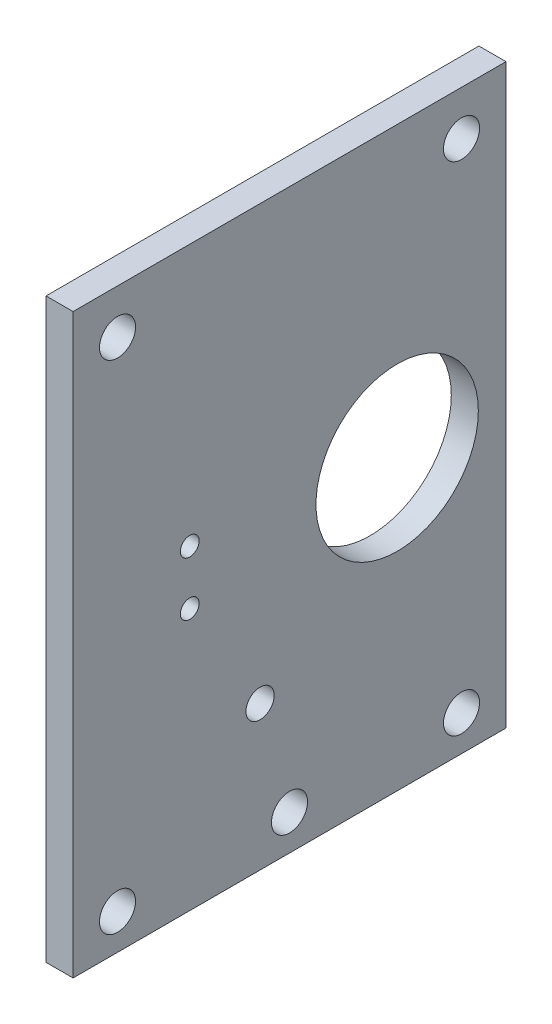
ISO-10303-21;
HEADER;
FILE_DESCRIPTION(('STEP AP214'),'2;1');
FILE_NAME('part.step','',(''),(''),'','','');
FILE_SCHEMA(('AUTOMOTIVE_DESIGN { 1 0 10303 214 1 1 1 1 }'));
ENDSEC;
DATA;
#1=APPLICATION_CONTEXT('core data for automotive mechanical design processes');
#2=APPLICATION_PROTOCOL_DEFINITION('international standard','automotive_design',2000,#1);
#3=PRODUCT_CONTEXT('',#1,'mechanical');
#4=PRODUCT('Part','Part','',(#3));
#5=PRODUCT_RELATED_PRODUCT_CATEGORY('part','',(#4));
#6=PRODUCT_DEFINITION_FORMATION('','',#4);
#7=PRODUCT_DEFINITION_CONTEXT('part definition',#1,'design');
#8=PRODUCT_DEFINITION('design','',#6,#7);
#9=PRODUCT_DEFINITION_SHAPE('','',#8);
#10=(LENGTH_UNIT() NAMED_UNIT(*) SI_UNIT(.MILLI.,.METRE.));
#11=(NAMED_UNIT(*) PLANE_ANGLE_UNIT() SI_UNIT($,.RADIAN.));
#12=(NAMED_UNIT(*) SI_UNIT($,.STERADIAN.) SOLID_ANGLE_UNIT());
#13=UNCERTAINTY_MEASURE_WITH_UNIT(LENGTH_MEASURE(1.E-05),#10,'distance_accuracy_value','');
#14=(GEOMETRIC_REPRESENTATION_CONTEXT(3) GLOBAL_UNCERTAINTY_ASSIGNED_CONTEXT((#13)) GLOBAL_UNIT_ASSIGNED_CONTEXT((#10,
#11,#12)) REPRESENTATION_CONTEXT('',''));
#15=CARTESIAN_POINT('',(0.,0.,0.));
#16=DIRECTION('',(0.,0.,1.));
#17=DIRECTION('',(1.,0.,0.));
#18=AXIS2_PLACEMENT_3D('',#15,#16,#17);
#19=CARTESIAN_POINT('',(4.7625,-50.8,-38.1));
#20=DIRECTION('',(0.,0.,1.));
#21=DIRECTION('',(1.,0.,0.));
#22=AXIS2_PLACEMENT_3D('',#19,#20,#21);
#23=PLANE('',#22);
#24=DIRECTION('',(0.,1.,0.));
#25=VECTOR('',#24,1.);
#26=CARTESIAN_POINT('',(0.,-50.8,-38.1));
#27=LINE('',#26,#25);
#28=CARTESIAN_POINT('',(0.,-50.8,-38.1));
#29=VERTEX_POINT('',#28);
#30=CARTESIAN_POINT('',(0.,50.8,-38.1));
#31=VERTEX_POINT('',#30);
#32=EDGE_CURVE('E98',#29,#31,#27,.T.);
#33=ORIENTED_EDGE('',*,*,#32,.T.);
#34=DIRECTION('',(-1.,0.,0.));
#35=VECTOR('',#34,1.);
#36=CARTESIAN_POINT('',(4.7625,50.8,-38.1));
#37=LINE('',#36,#35);
#38=CARTESIAN_POINT('',(4.7625,50.8,-38.1));
#39=VERTEX_POINT('',#38);
#40=EDGE_CURVE('E11',#39,#31,#37,.T.);
#41=ORIENTED_EDGE('',*,*,#40,.F.);
#42=DIRECTION('',(0.,1.,0.));
#43=VECTOR('',#42,1.);
#44=CARTESIAN_POINT('',(4.7625,-50.8,-38.1));
#45=LINE('',#44,#43);
#46=CARTESIAN_POINT('',(4.7625,-50.8,-38.1));
#47=VERTEX_POINT('',#46);
#48=EDGE_CURVE('E85',#47,#39,#45,.T.);
#49=ORIENTED_EDGE('',*,*,#48,.F.);
#50=DIRECTION('',(-1.,0.,0.));
#51=VECTOR('',#50,1.);
#52=CARTESIAN_POINT('',(4.7625,-50.8,-38.1));
#53=LINE('',#52,#51);
#54=EDGE_CURVE('E94',#47,#29,#53,.T.);
#55=ORIENTED_EDGE('',*,*,#54,.T.);
#56=EDGE_LOOP('',(#33,#41,#49,#55));
#57=FACE_BOUND('',#56,.T.);
#58=ADVANCED_FACE('F32',(#57),#23,.F.);
#59=CARTESIAN_POINT('',(4.7625,50.8,38.1));
#60=DIRECTION('',(0.,-1.,0.));
#61=DIRECTION('',(0.,0.,-1.));
#62=AXIS2_PLACEMENT_3D('',#59,#60,#61);
#63=PLANE('',#62);
#64=DIRECTION('',(0.,0.,1.));
#65=VECTOR('',#64,1.);
#66=CARTESIAN_POINT('',(0.,50.8,38.1));
#67=LINE('',#66,#65);
#68=CARTESIAN_POINT('',(0.,50.8,38.1));
#69=VERTEX_POINT('',#68);
#70=EDGE_CURVE('E89',#31,#69,#67,.T.);
#71=ORIENTED_EDGE('',*,*,#70,.T.);
#72=DIRECTION('',(-1.,0.,0.));
#73=VECTOR('',#72,1.);
#74=CARTESIAN_POINT('',(4.7625,50.8,38.1));
#75=LINE('',#74,#73);
#76=CARTESIAN_POINT('',(4.7625,50.8,38.1));
#77=VERTEX_POINT('',#76);
#78=EDGE_CURVE('E41',#77,#69,#75,.T.);
#79=ORIENTED_EDGE('',*,*,#78,.F.);
#80=DIRECTION('',(0.,0.,1.));
#81=VECTOR('',#80,1.);
#82=CARTESIAN_POINT('',(4.7625,50.8,38.1));
#83=LINE('',#82,#81);
#84=EDGE_CURVE('E80',#39,#77,#83,.T.);
#85=ORIENTED_EDGE('',*,*,#84,.F.);
#86=ORIENTED_EDGE('',*,*,#40,.T.);
#87=EDGE_LOOP('',(#71,#79,#85,#86));
#88=FACE_BOUND('',#87,.T.);
#89=ADVANCED_FACE('F88',(#88),#63,.F.);
#90=CARTESIAN_POINT('',(4.7625,-50.8,38.1));
#91=DIRECTION('',(0.,0.,-1.));
#92=DIRECTION('',(-1.,0.,0.));
#93=AXIS2_PLACEMENT_3D('',#90,#91,#92);
#94=PLANE('',#93);
#95=DIRECTION('',(0.,-1.,0.));
#96=VECTOR('',#95,1.);
#97=CARTESIAN_POINT('',(0.,-50.8,38.1));
#98=LINE('',#97,#96);
#99=CARTESIAN_POINT('',(0.,-50.8,38.1));
#100=VERTEX_POINT('',#99);
#101=EDGE_CURVE('E67',#69,#100,#98,.T.);
#102=ORIENTED_EDGE('',*,*,#101,.T.);
#103=DIRECTION('',(-1.,0.,0.));
#104=VECTOR('',#103,1.);
#105=CARTESIAN_POINT('',(4.7625,-50.8,38.1));
#106=LINE('',#105,#104);
#107=CARTESIAN_POINT('',(4.7625,-50.8,38.1));
#108=VERTEX_POINT('',#107);
#109=EDGE_CURVE('E90',#108,#100,#106,.T.);
#110=ORIENTED_EDGE('',*,*,#109,.F.);
#111=DIRECTION('',(0.,-1.,0.));
#112=VECTOR('',#111,1.);
#113=CARTESIAN_POINT('',(4.7625,-50.8,38.1));
#114=LINE('',#113,#112);
#115=EDGE_CURVE('E83',#77,#108,#114,.T.);
#116=ORIENTED_EDGE('',*,*,#115,.F.);
#117=ORIENTED_EDGE('',*,*,#78,.T.);
#118=EDGE_LOOP('',(#102,#110,#116,#117));
#119=FACE_BOUND('',#118,.T.);
#120=ADVANCED_FACE('F92',(#119),#94,.F.);
#121=CARTESIAN_POINT('',(4.7625,-50.8,38.1));
#122=DIRECTION('',(0.,1.,0.));
#123=DIRECTION('',(0.,0.,1.));
#124=AXIS2_PLACEMENT_3D('',#121,#122,#123);
#125=PLANE('',#124);
#126=DIRECTION('',(0.,0.,-1.));
#127=VECTOR('',#126,1.);
#128=CARTESIAN_POINT('',(0.,-50.8,38.1));
#129=LINE('',#128,#127);
#130=EDGE_CURVE('E73',#100,#29,#129,.T.);
#131=ORIENTED_EDGE('',*,*,#130,.T.);
#132=ORIENTED_EDGE('',*,*,#54,.F.);
#133=DIRECTION('',(0.,0.,-1.));
#134=VECTOR('',#133,1.);
#135=CARTESIAN_POINT('',(4.7625,-50.8,38.1));
#136=LINE('',#135,#134);
#137=EDGE_CURVE('E50',#108,#47,#136,.T.);
#138=ORIENTED_EDGE('',*,*,#137,.F.);
#139=ORIENTED_EDGE('',*,*,#109,.T.);
#140=EDGE_LOOP('',(#131,#132,#138,#139));
#141=FACE_BOUND('',#140,.T.);
#142=ADVANCED_FACE('F154',(#141),#125,.F.);
#143=CARTESIAN_POINT('',(4.7625,0.,0.));
#144=DIRECTION('',(-1.,0.,0.));
#145=DIRECTION('',(0.,0.,1.));
#146=AXIS2_PLACEMENT_3D('',#143,#144,#145);
#147=PLANE('',#146);
#148=CARTESIAN_POINT('',(4.7625,4.76250000000024,17.5641));
#149=DIRECTION('',(1.,0.,0.));
#150=DIRECTION('',(0.,0.,-1.));
#151=AXIS2_PLACEMENT_3D('',#148,#149,#150);
#152=CIRCLE('',#151,1.65);
#153=CARTESIAN_POINT('',(4.7625,4.76250000000024,15.9141));
#154=VERTEX_POINT('',#153);
#155=EDGE_CURVE('E287',#154,#154,#152,.T.);
#156=ORIENTED_EDGE('',*,*,#155,.F.);
#157=EDGE_LOOP('',(#156));
#158=FACE_BOUND('',#157,.T.);
#159=CARTESIAN_POINT('',(4.7625,-4.76249999999975,17.5641));
#160=DIRECTION('',(1.,0.,0.));
#161=DIRECTION('',(0.,0.,-1.));
#162=AXIS2_PLACEMENT_3D('',#159,#160,#161);
#163=CIRCLE('',#162,1.65);
#164=CARTESIAN_POINT('',(4.7625,-4.76249999999975,15.9141));
#165=VERTEX_POINT('',#164);
#166=EDGE_CURVE('E291',#165,#165,#163,.T.);
#167=ORIENTED_EDGE('',*,*,#166,.F.);
#168=EDGE_LOOP('',(#167));
#169=FACE_BOUND('',#168,.T.);
#170=CARTESIAN_POINT('',(4.7625,-44.5643,0.));
#171=DIRECTION('',(1.,0.,0.));
#172=DIRECTION('',(0.,0.,-1.));
#173=AXIS2_PLACEMENT_3D('',#170,#171,#172);
#174=CIRCLE('',#173,3.175);
#175=CARTESIAN_POINT('',(4.7625,-44.5643,-3.175));
#176=VERTEX_POINT('',#175);
#177=EDGE_CURVE('E137',#176,#176,#174,.T.);
#178=ORIENTED_EDGE('',*,*,#177,.F.);
#179=EDGE_LOOP('',(#178));
#180=FACE_BOUND('',#179,.T.);
#181=CARTESIAN_POINT('',(4.7625,-25.4,5.1816));
#182=DIRECTION('',(1.,0.,0.));
#183=DIRECTION('',(0.,0.,-1.));
#184=AXIS2_PLACEMENT_3D('',#181,#182,#183);
#185=CIRCLE('',#184,2.4892);
#186=CARTESIAN_POINT('',(4.7625,-25.4,2.6924));
#187=VERTEX_POINT('',#186);
#188=EDGE_CURVE('E127',#187,#187,#185,.T.);
#189=ORIENTED_EDGE('',*,*,#188,.F.);
#190=EDGE_LOOP('',(#189));
#191=FACE_BOUND('',#190,.T.);
#192=CARTESIAN_POINT('',(4.7625,0.,-18.9484));
#193=DIRECTION('',(1.,0.,0.));
#194=DIRECTION('',(0.,0.,-1.));
#195=AXIS2_PLACEMENT_3D('',#192,#193,#194);
#196=CIRCLE('',#195,14.2875);
#197=CARTESIAN_POINT('',(4.7625,0.,-33.2359));
#198=VERTEX_POINT('',#197);
#199=EDGE_CURVE('E124',#198,#198,#196,.T.);
#200=ORIENTED_EDGE('',*,*,#199,.F.);
#201=EDGE_LOOP('',(#200));
#202=FACE_BOUND('',#201,.T.);
#203=CARTESIAN_POINT('',(4.7625,-44.5643,30.2768));
#204=DIRECTION('',(1.,0.,0.));
#205=DIRECTION('',(0.,0.,-1.));
#206=AXIS2_PLACEMENT_3D('',#203,#204,#205);
#207=CIRCLE('',#206,3.175);
#208=CARTESIAN_POINT('',(4.7625,-44.5643,27.1018));
#209=VERTEX_POINT('',#208);
#210=EDGE_CURVE('E121',#209,#209,#207,.T.);
#211=ORIENTED_EDGE('',*,*,#210,.F.);
#212=EDGE_LOOP('',(#211));
#213=FACE_BOUND('',#212,.T.);
#214=CARTESIAN_POINT('',(4.7625,42.9768,30.2768));
#215=DIRECTION('',(1.,0.,0.));
#216=DIRECTION('',(0.,0.,-1.));
#217=AXIS2_PLACEMENT_3D('',#214,#215,#216);
#218=CIRCLE('',#217,3.175);
#219=CARTESIAN_POINT('',(4.7625,42.9768,27.1018));
#220=VERTEX_POINT('',#219);
#221=EDGE_CURVE('E117',#220,#220,#218,.T.);
#222=ORIENTED_EDGE('',*,*,#221,.F.);
#223=EDGE_LOOP('',(#222));
#224=FACE_BOUND('',#223,.T.);
#225=CARTESIAN_POINT('',(4.7625,-44.5643,-30.2768));
#226=DIRECTION('',(1.,0.,0.));
#227=DIRECTION('',(0.,0.,-1.));
#228=AXIS2_PLACEMENT_3D('',#225,#226,#227);
#229=CIRCLE('',#228,3.17499999999999);
#230=CARTESIAN_POINT('',(4.7625,-44.5643,-33.4518));
#231=VERTEX_POINT('',#230);
#232=EDGE_CURVE('E113',#231,#231,#229,.T.);
#233=ORIENTED_EDGE('',*,*,#232,.F.);
#234=EDGE_LOOP('',(#233));
#235=FACE_BOUND('',#234,.T.);
#236=CARTESIAN_POINT('',(4.7625,42.9768,-30.2768));
#237=DIRECTION('',(1.,0.,0.));
#238=DIRECTION('',(0.,0.,-1.));
#239=AXIS2_PLACEMENT_3D('',#236,#237,#238);
#240=CIRCLE('',#239,3.175);
#241=CARTESIAN_POINT('',(4.7625,42.9768,-33.4518));
#242=VERTEX_POINT('',#241);
#243=EDGE_CURVE('E109',#242,#242,#240,.T.);
#244=ORIENTED_EDGE('',*,*,#243,.F.);
#245=EDGE_LOOP('',(#244));
#246=FACE_BOUND('',#245,.T.);
#247=ORIENTED_EDGE('',*,*,#48,.T.);
#248=ORIENTED_EDGE('',*,*,#84,.T.);
#249=ORIENTED_EDGE('',*,*,#115,.T.);
#250=ORIENTED_EDGE('',*,*,#137,.T.);
#251=EDGE_LOOP('',(#247,#248,#249,#250));
#252=FACE_BOUND('',#251,.T.);
#253=ADVANCED_FACE('F81',(#158,#169,#180,#191,#202,#213,#224,#235,#246,#252),#147,.F.);
#254=CARTESIAN_POINT('',(0.,0.,0.));
#255=DIRECTION('',(-1.,0.,0.));
#256=DIRECTION('',(0.,0.,1.));
#257=AXIS2_PLACEMENT_3D('',#254,#255,#256);
#258=PLANE('',#257);
#259=CARTESIAN_POINT('',(0.,4.76250000000024,17.5641));
#260=DIRECTION('',(-1.,0.,0.));
#261=DIRECTION('',(0.,0.,1.));
#262=AXIS2_PLACEMENT_3D('',#259,#260,#261);
#263=CIRCLE('',#262,1.65);
#264=CARTESIAN_POINT('',(0.,4.76250000000024,19.2141));
#265=VERTEX_POINT('',#264);
#266=EDGE_CURVE('E290',#265,#265,#263,.T.);
#267=ORIENTED_EDGE('',*,*,#266,.F.);
#268=EDGE_LOOP('',(#267));
#269=FACE_BOUND('',#268,.T.);
#270=CARTESIAN_POINT('',(0.,-4.76249999999975,17.5641));
#271=DIRECTION('',(-1.,0.,0.));
#272=DIRECTION('',(0.,0.,1.));
#273=AXIS2_PLACEMENT_3D('',#270,#271,#272);
#274=CIRCLE('',#273,1.65);
#275=CARTESIAN_POINT('',(0.,-4.76249999999975,19.2141));
#276=VERTEX_POINT('',#275);
#277=EDGE_CURVE('E294',#276,#276,#274,.T.);
#278=ORIENTED_EDGE('',*,*,#277,.F.);
#279=EDGE_LOOP('',(#278));
#280=FACE_BOUND('',#279,.T.);
#281=CARTESIAN_POINT('',(0.,-44.5643,0.));
#282=DIRECTION('',(-1.,0.,0.));
#283=DIRECTION('',(0.,0.,1.));
#284=AXIS2_PLACEMENT_3D('',#281,#282,#283);
#285=CIRCLE('',#284,3.175);
#286=CARTESIAN_POINT('',(0.,-44.5643,3.175));
#287=VERTEX_POINT('',#286);
#288=EDGE_CURVE('E35',#287,#287,#285,.T.);
#289=ORIENTED_EDGE('',*,*,#288,.F.);
#290=EDGE_LOOP('',(#289));
#291=FACE_BOUND('',#290,.T.);
#292=CARTESIAN_POINT('',(0.,-25.4,5.1816));
#293=DIRECTION('',(-1.,0.,0.));
#294=DIRECTION('',(0.,0.,1.));
#295=AXIS2_PLACEMENT_3D('',#292,#293,#294);
#296=CIRCLE('',#295,2.4892);
#297=CARTESIAN_POINT('',(0.,-25.4,7.6708));
#298=VERTEX_POINT('',#297);
#299=EDGE_CURVE('E125',#298,#298,#296,.T.);
#300=ORIENTED_EDGE('',*,*,#299,.F.);
#301=EDGE_LOOP('',(#300));
#302=FACE_BOUND('',#301,.T.);
#303=CARTESIAN_POINT('',(0.,0.,-18.9484));
#304=DIRECTION('',(-1.,0.,0.));
#305=DIRECTION('',(0.,0.,1.));
#306=AXIS2_PLACEMENT_3D('',#303,#304,#305);
#307=CIRCLE('',#306,14.2875);
#308=CARTESIAN_POINT('',(0.,0.,-4.66089999999999));
#309=VERTEX_POINT('',#308);
#310=EDGE_CURVE('E122',#309,#309,#307,.T.);
#311=ORIENTED_EDGE('',*,*,#310,.F.);
#312=EDGE_LOOP('',(#311));
#313=FACE_BOUND('',#312,.T.);
#314=CARTESIAN_POINT('',(0.,-44.5643,30.2768));
#315=DIRECTION('',(-1.,0.,0.));
#316=DIRECTION('',(0.,0.,1.));
#317=AXIS2_PLACEMENT_3D('',#314,#315,#316);
#318=CIRCLE('',#317,3.175);
#319=CARTESIAN_POINT('',(0.,-44.5643,33.4518));
#320=VERTEX_POINT('',#319);
#321=EDGE_CURVE('E118',#320,#320,#318,.T.);
#322=ORIENTED_EDGE('',*,*,#321,.F.);
#323=EDGE_LOOP('',(#322));
#324=FACE_BOUND('',#323,.T.);
#325=CARTESIAN_POINT('',(0.,42.9768,30.2768));
#326=DIRECTION('',(-1.,0.,0.));
#327=DIRECTION('',(0.,0.,1.));
#328=AXIS2_PLACEMENT_3D('',#325,#326,#327);
#329=CIRCLE('',#328,3.175);
#330=CARTESIAN_POINT('',(0.,42.9768,33.4518));
#331=VERTEX_POINT('',#330);
#332=EDGE_CURVE('E114',#331,#331,#329,.T.);
#333=ORIENTED_EDGE('',*,*,#332,.F.);
#334=EDGE_LOOP('',(#333));
#335=FACE_BOUND('',#334,.T.);
#336=CARTESIAN_POINT('',(0.,-44.5643,-30.2768));
#337=DIRECTION('',(-1.,0.,0.));
#338=DIRECTION('',(0.,0.,1.));
#339=AXIS2_PLACEMENT_3D('',#336,#337,#338);
#340=CIRCLE('',#339,3.17499999999999);
#341=CARTESIAN_POINT('',(0.,-44.5643,-27.1018));
#342=VERTEX_POINT('',#341);
#343=EDGE_CURVE('E110',#342,#342,#340,.T.);
#344=ORIENTED_EDGE('',*,*,#343,.F.);
#345=EDGE_LOOP('',(#344));
#346=FACE_BOUND('',#345,.T.);
#347=CARTESIAN_POINT('',(0.,42.9768,-30.2768));
#348=DIRECTION('',(-1.,0.,0.));
#349=DIRECTION('',(0.,0.,1.));
#350=AXIS2_PLACEMENT_3D('',#347,#348,#349);
#351=CIRCLE('',#350,3.175);
#352=CARTESIAN_POINT('',(0.,42.9768,-27.1018));
#353=VERTEX_POINT('',#352);
#354=EDGE_CURVE('E101',#353,#353,#351,.T.);
#355=ORIENTED_EDGE('',*,*,#354,.F.);
#356=EDGE_LOOP('',(#355));
#357=FACE_BOUND('',#356,.T.);
#358=ORIENTED_EDGE('',*,*,#32,.F.);
#359=ORIENTED_EDGE('',*,*,#130,.F.);
#360=ORIENTED_EDGE('',*,*,#101,.F.);
#361=ORIENTED_EDGE('',*,*,#70,.F.);
#362=EDGE_LOOP('',(#358,#359,#360,#361));
#363=FACE_BOUND('',#362,.T.);
#364=ADVANCED_FACE('F153',(#269,#280,#291,#302,#313,#324,#335,#346,#357,#363),#258,.T.);
#365=CARTESIAN_POINT('',(-1.5875,42.9768,-30.2768));
#366=DIRECTION('',(1.,0.,0.));
#367=DIRECTION('',(0.,0.,-1.));
#368=AXIS2_PLACEMENT_3D('',#365,#366,#367);
#369=CYLINDRICAL_SURFACE('',#368,3.175);
#370=ORIENTED_EDGE('',*,*,#354,.T.);
#371=EDGE_LOOP('',(#370));
#372=FACE_BOUND('',#371,.T.);
#373=ORIENTED_EDGE('',*,*,#243,.T.);
#374=EDGE_LOOP('',(#373));
#375=FACE_BOUND('',#374,.T.);
#376=ADVANCED_FACE('F150',(#372,#375),#369,.F.);
#377=CARTESIAN_POINT('',(-1.5875,-44.5643,-30.2768));
#378=DIRECTION('',(1.,0.,0.));
#379=DIRECTION('',(0.,0.,-1.));
#380=AXIS2_PLACEMENT_3D('',#377,#378,#379);
#381=CYLINDRICAL_SURFACE('',#380,3.17499999999999);
#382=ORIENTED_EDGE('',*,*,#343,.T.);
#383=EDGE_LOOP('',(#382));
#384=FACE_BOUND('',#383,.T.);
#385=ORIENTED_EDGE('',*,*,#232,.T.);
#386=EDGE_LOOP('',(#385));
#387=FACE_BOUND('',#386,.T.);
#388=ADVANCED_FACE('F194',(#384,#387),#381,.F.);
#389=CARTESIAN_POINT('',(-1.5875,42.9768,30.2768));
#390=DIRECTION('',(1.,0.,0.));
#391=DIRECTION('',(0.,0.,-1.));
#392=AXIS2_PLACEMENT_3D('',#389,#390,#391);
#393=CYLINDRICAL_SURFACE('',#392,3.175);
#394=ORIENTED_EDGE('',*,*,#332,.T.);
#395=EDGE_LOOP('',(#394));
#396=FACE_BOUND('',#395,.T.);
#397=ORIENTED_EDGE('',*,*,#221,.T.);
#398=EDGE_LOOP('',(#397));
#399=FACE_BOUND('',#398,.T.);
#400=ADVANCED_FACE('F204',(#396,#399),#393,.F.);
#401=CARTESIAN_POINT('',(-1.5875,-44.5643,30.2768));
#402=DIRECTION('',(1.,0.,0.));
#403=DIRECTION('',(0.,0.,-1.));
#404=AXIS2_PLACEMENT_3D('',#401,#402,#403);
#405=CYLINDRICAL_SURFACE('',#404,3.175);
#406=ORIENTED_EDGE('',*,*,#321,.T.);
#407=EDGE_LOOP('',(#406));
#408=FACE_BOUND('',#407,.T.);
#409=ORIENTED_EDGE('',*,*,#210,.T.);
#410=EDGE_LOOP('',(#409));
#411=FACE_BOUND('',#410,.T.);
#412=ADVANCED_FACE('F214',(#408,#411),#405,.F.);
#413=CARTESIAN_POINT('',(-1.5875,0.,-18.9484));
#414=DIRECTION('',(1.,0.,0.));
#415=DIRECTION('',(0.,0.,-1.));
#416=AXIS2_PLACEMENT_3D('',#413,#414,#415);
#417=CYLINDRICAL_SURFACE('',#416,14.2875);
#418=ORIENTED_EDGE('',*,*,#310,.T.);
#419=EDGE_LOOP('',(#418));
#420=FACE_BOUND('',#419,.T.);
#421=ORIENTED_EDGE('',*,*,#199,.T.);
#422=EDGE_LOOP('',(#421));
#423=FACE_BOUND('',#422,.T.);
#424=ADVANCED_FACE('F224',(#420,#423),#417,.F.);
#425=CARTESIAN_POINT('',(-1.5875,-25.4,5.1816));
#426=DIRECTION('',(1.,0.,0.));
#427=DIRECTION('',(0.,0.,-1.));
#428=AXIS2_PLACEMENT_3D('',#425,#426,#427);
#429=CYLINDRICAL_SURFACE('',#428,2.4892);
#430=ORIENTED_EDGE('',*,*,#299,.T.);
#431=EDGE_LOOP('',(#430));
#432=FACE_BOUND('',#431,.T.);
#433=ORIENTED_EDGE('',*,*,#188,.T.);
#434=EDGE_LOOP('',(#433));
#435=FACE_BOUND('',#434,.T.);
#436=ADVANCED_FACE('F234',(#432,#435),#429,.F.);
#437=CARTESIAN_POINT('',(-1.5875,-44.5643,0.));
#438=DIRECTION('',(1.,0.,0.));
#439=DIRECTION('',(0.,0.,-1.));
#440=AXIS2_PLACEMENT_3D('',#437,#438,#439);
#441=CYLINDRICAL_SURFACE('',#440,3.175);
#442=ORIENTED_EDGE('',*,*,#288,.T.);
#443=EDGE_LOOP('',(#442));
#444=FACE_BOUND('',#443,.T.);
#445=ORIENTED_EDGE('',*,*,#177,.T.);
#446=EDGE_LOOP('',(#445));
#447=FACE_BOUND('',#446,.T.);
#448=ADVANCED_FACE('F244',(#444,#447),#441,.F.);
#449=CARTESIAN_POINT('',(4.7625,-4.76249999999975,17.5641));
#450=DIRECTION('',(1.,0.,0.));
#451=DIRECTION('',(0.,0.,-1.));
#452=AXIS2_PLACEMENT_3D('',#449,#450,#451);
#453=CYLINDRICAL_SURFACE('',#452,1.65);
#454=ORIENTED_EDGE('',*,*,#166,.T.);
#455=EDGE_LOOP('',(#454));
#456=FACE_BOUND('',#455,.T.);
#457=ORIENTED_EDGE('',*,*,#277,.T.);
#458=EDGE_LOOP('',(#457));
#459=FACE_BOUND('',#458,.T.);
#460=ADVANCED_FACE('F252',(#456,#459),#453,.F.);
#461=CARTESIAN_POINT('',(4.7625,4.76250000000024,17.5641));
#462=DIRECTION('',(1.,0.,0.));
#463=DIRECTION('',(0.,0.,-1.));
#464=AXIS2_PLACEMENT_3D('',#461,#462,#463);
#465=CYLINDRICAL_SURFACE('',#464,1.65);
#466=ORIENTED_EDGE('',*,*,#155,.T.);
#467=EDGE_LOOP('',(#466));
#468=FACE_BOUND('',#467,.T.);
#469=ORIENTED_EDGE('',*,*,#266,.T.);
#470=EDGE_LOOP('',(#469));
#471=FACE_BOUND('',#470,.T.);
#472=ADVANCED_FACE('F271',(#468,#471),#465,.F.);
#473=CLOSED_SHELL('',(#58,#89,#120,#142,#253,#364,#376,#388,#400,#412,#424,#436,#448,#460,#472));
#474=MANIFOLD_SOLID_BREP('B2',#473);
#475=ADVANCED_BREP_SHAPE_REPRESENTATION('',(#18,#474),#14);
#476=SHAPE_DEFINITION_REPRESENTATION(#9,#475);
ENDSEC;
END-ISO-10303-21;
